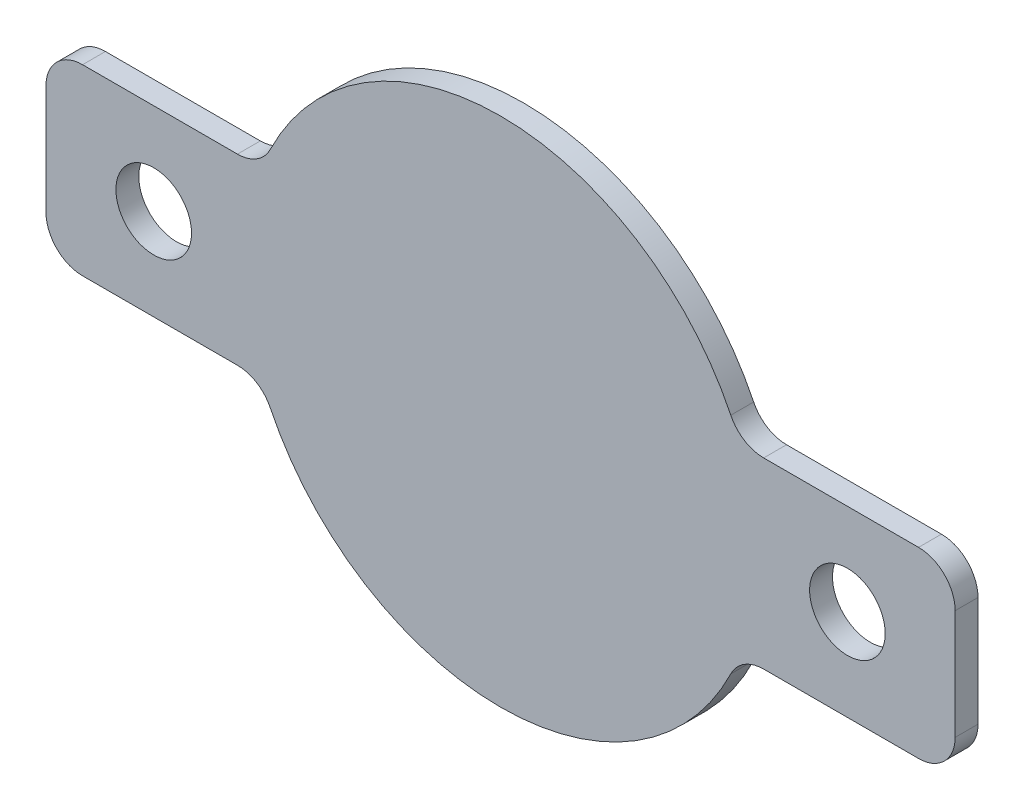
ISO-10303-21;
HEADER;
FILE_DESCRIPTION(('STEP AP214'),'2;1');
FILE_NAME('part.step','',(''),(''),'','','');
FILE_SCHEMA(('AUTOMOTIVE_DESIGN { 1 0 10303 214 1 1 1 1 }'));
ENDSEC;
DATA;
#1=APPLICATION_CONTEXT('core data for automotive mechanical design processes');
#2=APPLICATION_PROTOCOL_DEFINITION('international standard','automotive_design',2000,#1);
#3=PRODUCT_CONTEXT('',#1,'mechanical');
#4=PRODUCT('Part','Part','',(#3));
#5=PRODUCT_RELATED_PRODUCT_CATEGORY('part','',(#4));
#6=PRODUCT_DEFINITION_FORMATION('','',#4);
#7=PRODUCT_DEFINITION_CONTEXT('part definition',#1,'design');
#8=PRODUCT_DEFINITION('design','',#6,#7);
#9=PRODUCT_DEFINITION_SHAPE('','',#8);
#10=(LENGTH_UNIT() NAMED_UNIT(*) SI_UNIT(.MILLI.,.METRE.));
#11=(NAMED_UNIT(*) PLANE_ANGLE_UNIT() SI_UNIT($,.RADIAN.));
#12=(NAMED_UNIT(*) SI_UNIT($,.STERADIAN.) SOLID_ANGLE_UNIT());
#13=UNCERTAINTY_MEASURE_WITH_UNIT(LENGTH_MEASURE(1.E-05),#10,'distance_accuracy_value','');
#14=(GEOMETRIC_REPRESENTATION_CONTEXT(3) GLOBAL_UNCERTAINTY_ASSIGNED_CONTEXT((#13)) GLOBAL_UNIT_ASSIGNED_CONTEXT((#10,
#11,#12)) REPRESENTATION_CONTEXT('',''));
#15=CARTESIAN_POINT('',(0.,0.,0.));
#16=DIRECTION('',(0.,0.,1.));
#17=DIRECTION('',(1.,0.,0.));
#18=AXIS2_PLACEMENT_3D('',#15,#16,#17);
#19=CARTESIAN_POINT('',(-0.514545782896191,2.18955939318799,1.5875));
#20=DIRECTION('',(0.,0.,1.));
#21=DIRECTION('',(1.,0.,0.));
#22=AXIS2_PLACEMENT_3D('',#19,#20,#21);
#23=PLANE('',#22);
#24=CARTESIAN_POINT('',(23.5734032231875,2.18955939318799,1.5875));
#25=DIRECTION('',(0.,0.,1.));
#26=DIRECTION('',(1.,0.,0.));
#27=AXIS2_PLACEMENT_3D('',#24,#25,#26);
#28=CIRCLE('',#27,2.625);
#29=CARTESIAN_POINT('',(26.1984032231875,2.18955939318799,1.5875));
#30=VERTEX_POINT('',#29);
#31=EDGE_CURVE('E293',#30,#30,#28,.T.);
#32=ORIENTED_EDGE('',*,*,#31,.F.);
#33=EDGE_LOOP('',(#32));
#34=FACE_BOUND('',#33,.T.);
#35=DIRECTION('',(0.,-1.,0.));
#36=VECTOR('',#35,1.);
#37=CARTESIAN_POINT('',(-32.0830388201736,-4.16044060681201,1.5875));
#38=LINE('',#37,#36);
#39=CARTESIAN_POINT('',(-32.0830388201736,5.99955939318799,1.5875));
#40=VERTEX_POINT('',#39);
#41=CARTESIAN_POINT('',(-32.0830388201736,-1.62044060681201,1.5875));
#42=VERTEX_POINT('',#41);
#43=EDGE_CURVE('E322',#40,#42,#38,.T.);
#44=ORIENTED_EDGE('',*,*,#43,.T.);
#45=CARTESIAN_POINT('',(-29.5430388201736,-1.62044060681201,1.5875));
#46=DIRECTION('',(0.,0.,1.));
#47=DIRECTION('',(1.,0.,0.));
#48=AXIS2_PLACEMENT_3D('',#45,#46,#47);
#49=CIRCLE('',#48,2.54);
#50=CARTESIAN_POINT('',(-29.5430388201736,-4.16044060681201,1.5875));
#51=VERTEX_POINT('',#50);
#52=EDGE_CURVE('E220',#42,#51,#49,.T.);
#53=ORIENTED_EDGE('',*,*,#52,.T.);
#54=DIRECTION('',(1.,0.,0.));
#55=VECTOR('',#54,1.);
#56=CARTESIAN_POINT('',(-17.1219507577862,-4.16044060681201,1.5875));
#57=LINE('',#56,#55);
#58=CARTESIAN_POINT('',(-18.7866638867177,-4.16044060681201,1.5875));
#59=VERTEX_POINT('',#58);
#60=EDGE_CURVE('E175',#51,#59,#57,.T.);
#61=ORIENTED_EDGE('',*,*,#60,.T.);
#62=CARTESIAN_POINT('',(-18.7866638867177,-6.70044060681201,1.5875));
#63=DIRECTION('',(0.,0.,1.));
#64=DIRECTION('',(1.,0.,0.));
#65=AXIS2_PLACEMENT_3D('',#62,#63,#64);
#66=CIRCLE('',#65,2.54);
#67=CARTESIAN_POINT('',(-16.50264912374,-5.58919060681201,1.5875));
#68=VERTEX_POINT('',#67);
#69=EDGE_CURVE('E277',#59,#68,#66,.F.);
#70=ORIENTED_EDGE('',*,*,#69,.T.);
#71=CARTESIAN_POINT('',(-0.514545782896191,2.18955939318799,1.5875));
#72=DIRECTION('',(0.,0.,1.));
#73=DIRECTION('',(1.,0.,0.));
#74=AXIS2_PLACEMENT_3D('',#71,#72,#73);
#75=CIRCLE('',#74,17.78);
#76=CARTESIAN_POINT('',(15.4735575579476,-5.58919060681201,1.5875));
#77=VERTEX_POINT('',#76);
#78=EDGE_CURVE('E185',#68,#77,#75,.T.);
#79=ORIENTED_EDGE('',*,*,#78,.T.);
#80=CARTESIAN_POINT('',(17.7575723209253,-6.70044060681201,1.5875));
#81=DIRECTION('',(0.,0.,1.));
#82=DIRECTION('',(1.,0.,0.));
#83=AXIS2_PLACEMENT_3D('',#80,#81,#82);
#84=CIRCLE('',#83,2.54);
#85=CARTESIAN_POINT('',(17.7575723209253,-4.16044060681201,1.5875));
#86=VERTEX_POINT('',#85);
#87=EDGE_CURVE('E11',#77,#86,#84,.F.);
#88=ORIENTED_EDGE('',*,*,#87,.T.);
#89=DIRECTION('',(1.,0.,0.));
#90=VECTOR('',#89,1.);
#91=CARTESIAN_POINT('',(16.0928591919938,-4.16044060681201,1.5875));
#92=LINE('',#91,#90);
#93=CARTESIAN_POINT('',(28.5139472543812,-4.16044060681201,1.5875));
#94=VERTEX_POINT('',#93);
#95=EDGE_CURVE('E191',#86,#94,#92,.T.);
#96=ORIENTED_EDGE('',*,*,#95,.T.);
#97=CARTESIAN_POINT('',(28.5139472543812,-1.62044060681201,1.5875));
#98=DIRECTION('',(0.,0.,1.));
#99=DIRECTION('',(1.,0.,0.));
#100=AXIS2_PLACEMENT_3D('',#97,#98,#99);
#101=CIRCLE('',#100,2.54);
#102=CARTESIAN_POINT('',(31.0539472543812,-1.62044060681201,1.5875));
#103=VERTEX_POINT('',#102);
#104=EDGE_CURVE('E211',#94,#103,#101,.T.);
#105=ORIENTED_EDGE('',*,*,#104,.T.);
#106=DIRECTION('',(0.,1.,0.));
#107=VECTOR('',#106,1.);
#108=CARTESIAN_POINT('',(31.0539472543812,-4.16044060681201,1.5875));
#109=LINE('',#108,#107);
#110=CARTESIAN_POINT('',(31.0539472543812,5.99955939318799,1.5875));
#111=VERTEX_POINT('',#110);
#112=EDGE_CURVE('E305',#103,#111,#109,.T.);
#113=ORIENTED_EDGE('',*,*,#112,.T.);
#114=CARTESIAN_POINT('',(28.5139472543812,5.99955939318799,1.5875));
#115=DIRECTION('',(0.,0.,1.));
#116=DIRECTION('',(1.,0.,0.));
#117=AXIS2_PLACEMENT_3D('',#114,#115,#116);
#118=CIRCLE('',#117,2.54);
#119=CARTESIAN_POINT('',(28.5139472543812,8.53955939318799,1.5875));
#120=VERTEX_POINT('',#119);
#121=EDGE_CURVE('E214',#111,#120,#118,.T.);
#122=ORIENTED_EDGE('',*,*,#121,.T.);
#123=DIRECTION('',(-1.,0.,0.));
#124=VECTOR('',#123,1.);
#125=CARTESIAN_POINT('',(31.0539472543812,8.53955939318799,1.5875));
#126=LINE('',#125,#124);
#127=CARTESIAN_POINT('',(17.7575723209253,8.53955939318799,1.5875));
#128=VERTEX_POINT('',#127);
#129=EDGE_CURVE('E309',#120,#128,#126,.T.);
#130=ORIENTED_EDGE('',*,*,#129,.T.);
#131=CARTESIAN_POINT('',(17.7575723209253,11.079559393188,1.5875));
#132=DIRECTION('',(0.,0.,1.));
#133=DIRECTION('',(1.,0.,0.));
#134=AXIS2_PLACEMENT_3D('',#131,#132,#133);
#135=CIRCLE('',#134,2.54);
#136=CARTESIAN_POINT('',(15.4735575579476,9.96830939318799,1.5875));
#137=VERTEX_POINT('',#136);
#138=EDGE_CURVE('E267',#128,#137,#135,.F.);
#139=ORIENTED_EDGE('',*,*,#138,.T.);
#140=CARTESIAN_POINT('',(-0.514545782896191,2.18955939318799,1.5875));
#141=DIRECTION('',(0.,0.,1.));
#142=DIRECTION('',(1.,0.,0.));
#143=AXIS2_PLACEMENT_3D('',#140,#141,#142);
#144=CIRCLE('',#143,17.78);
#145=CARTESIAN_POINT('',(-16.50264912374,9.96830939318799,1.5875));
#146=VERTEX_POINT('',#145);
#147=EDGE_CURVE('E316',#137,#146,#144,.T.);
#148=ORIENTED_EDGE('',*,*,#147,.T.);
#149=CARTESIAN_POINT('',(-18.7866638867177,11.079559393188,1.5875));
#150=DIRECTION('',(0.,0.,1.));
#151=DIRECTION('',(1.,0.,0.));
#152=AXIS2_PLACEMENT_3D('',#149,#150,#151);
#153=CIRCLE('',#152,2.54);
#154=CARTESIAN_POINT('',(-18.7866638867177,8.53955939318799,1.5875));
#155=VERTEX_POINT('',#154);
#156=EDGE_CURVE('E62',#146,#155,#153,.F.);
#157=ORIENTED_EDGE('',*,*,#156,.T.);
#158=DIRECTION('',(-1.,0.,0.));
#159=VECTOR('',#158,1.);
#160=CARTESIAN_POINT('',(-32.0830388201736,8.53955939318799,1.5875));
#161=LINE('',#160,#159);
#162=CARTESIAN_POINT('',(-29.5430388201736,8.53955939318799,1.5875));
#163=VERTEX_POINT('',#162);
#164=EDGE_CURVE('E319',#155,#163,#161,.T.);
#165=ORIENTED_EDGE('',*,*,#164,.T.);
#166=CARTESIAN_POINT('',(-29.5430388201736,5.99955939318799,1.5875));
#167=DIRECTION('',(0.,0.,1.));
#168=DIRECTION('',(1.,0.,0.));
#169=AXIS2_PLACEMENT_3D('',#166,#167,#168);
#170=CIRCLE('',#169,2.54);
#171=EDGE_CURVE('E217',#163,#40,#170,.T.);
#172=ORIENTED_EDGE('',*,*,#171,.T.);
#173=EDGE_LOOP('',(#44,#53,#61,#70,#79,#88,#96,#105,#113,#122,#130,#139,#148,#157,#165,#172));
#174=FACE_BOUND('',#173,.T.);
#175=CARTESIAN_POINT('',(-24.6024947889799,2.18955939318799,1.5875));
#176=DIRECTION('',(0.,0.,1.));
#177=DIRECTION('',(1.,0.,0.));
#178=AXIS2_PLACEMENT_3D('',#175,#176,#177);
#179=CIRCLE('',#178,2.625);
#180=CARTESIAN_POINT('',(-21.9774947889799,2.18955939318799,1.5875));
#181=VERTEX_POINT('',#180);
#182=EDGE_CURVE('E383',#181,#181,#179,.T.);
#183=ORIENTED_EDGE('',*,*,#182,.F.);
#184=EDGE_LOOP('',(#183));
#185=FACE_BOUND('',#184,.T.);
#186=ADVANCED_FACE('F39',(#34,#174,#185),#23,.T.);
#187=CARTESIAN_POINT('',(-0.514545782896191,2.18955939318799,0.));
#188=DIRECTION('',(0.,0.,1.));
#189=DIRECTION('',(1.,0.,0.));
#190=AXIS2_PLACEMENT_3D('',#187,#188,#189);
#191=PLANE('',#190);
#192=DIRECTION('',(1.,0.,0.));
#193=VECTOR('',#192,1.);
#194=CARTESIAN_POINT('',(-17.1219507577862,-4.16044060681201,0.));
#195=LINE('',#194,#193);
#196=CARTESIAN_POINT('',(-29.5430388201736,-4.16044060681201,0.));
#197=VERTEX_POINT('',#196);
#198=CARTESIAN_POINT('',(-18.7866638867177,-4.16044060681201,0.));
#199=VERTEX_POINT('',#198);
#200=EDGE_CURVE('E172',#197,#199,#195,.T.);
#201=ORIENTED_EDGE('',*,*,#200,.F.);
#202=CARTESIAN_POINT('',(-29.5430388201736,-1.62044060681201,0.));
#203=DIRECTION('',(0.,0.,1.));
#204=DIRECTION('',(1.,0.,0.));
#205=AXIS2_PLACEMENT_3D('',#202,#203,#204);
#206=CIRCLE('',#205,2.54);
#207=CARTESIAN_POINT('',(-32.0830388201736,-1.62044060681201,0.));
#208=VERTEX_POINT('',#207);
#209=EDGE_CURVE('E154',#197,#208,#206,.F.);
#210=ORIENTED_EDGE('',*,*,#209,.T.);
#211=DIRECTION('',(0.,-1.,0.));
#212=VECTOR('',#211,1.);
#213=CARTESIAN_POINT('',(-32.0830388201736,-4.16044060681201,0.));
#214=LINE('',#213,#212);
#215=CARTESIAN_POINT('',(-32.0830388201736,5.99955939318799,0.));
#216=VERTEX_POINT('',#215);
#217=EDGE_CURVE('E186',#216,#208,#214,.T.);
#218=ORIENTED_EDGE('',*,*,#217,.F.);
#219=CARTESIAN_POINT('',(-29.5430388201736,5.99955939318799,0.));
#220=DIRECTION('',(0.,0.,1.));
#221=DIRECTION('',(1.,0.,0.));
#222=AXIS2_PLACEMENT_3D('',#219,#220,#221);
#223=CIRCLE('',#222,2.54);
#224=CARTESIAN_POINT('',(-29.5430388201736,8.53955939318799,0.));
#225=VERTEX_POINT('',#224);
#226=EDGE_CURVE('E166',#216,#225,#223,.F.);
#227=ORIENTED_EDGE('',*,*,#226,.T.);
#228=DIRECTION('',(-1.,0.,0.));
#229=VECTOR('',#228,1.);
#230=CARTESIAN_POINT('',(-32.0830388201736,8.53955939318799,0.));
#231=LINE('',#230,#229);
#232=CARTESIAN_POINT('',(-18.7866638867177,8.53955939318799,0.));
#233=VERTEX_POINT('',#232);
#234=EDGE_CURVE('E193',#233,#225,#231,.T.);
#235=ORIENTED_EDGE('',*,*,#234,.F.);
#236=CARTESIAN_POINT('',(-18.7866638867177,11.079559393188,0.));
#237=DIRECTION('',(0.,0.,1.));
#238=DIRECTION('',(1.,0.,0.));
#239=AXIS2_PLACEMENT_3D('',#236,#237,#238);
#240=CIRCLE('',#239,2.54);
#241=CARTESIAN_POINT('',(-16.50264912374,9.96830939318799,0.));
#242=VERTEX_POINT('',#241);
#243=EDGE_CURVE('E270',#233,#242,#240,.T.);
#244=ORIENTED_EDGE('',*,*,#243,.T.);
#245=CARTESIAN_POINT('',(-0.514545782896191,2.18955939318799,0.));
#246=DIRECTION('',(0.,0.,1.));
#247=DIRECTION('',(1.,0.,0.));
#248=AXIS2_PLACEMENT_3D('',#245,#246,#247);
#249=CIRCLE('',#248,17.78);
#250=CARTESIAN_POINT('',(15.4735575579476,9.96830939318799,0.));
#251=VERTEX_POINT('',#250);
#252=EDGE_CURVE('E337',#251,#242,#249,.T.);
#253=ORIENTED_EDGE('',*,*,#252,.F.);
#254=CARTESIAN_POINT('',(17.7575723209253,11.079559393188,0.));
#255=DIRECTION('',(0.,0.,1.));
#256=DIRECTION('',(1.,0.,0.));
#257=AXIS2_PLACEMENT_3D('',#254,#255,#256);
#258=CIRCLE('',#257,2.54);
#259=CARTESIAN_POINT('',(17.7575723209253,8.53955939318799,0.));
#260=VERTEX_POINT('',#259);
#261=EDGE_CURVE('E264',#251,#260,#258,.T.);
#262=ORIENTED_EDGE('',*,*,#261,.T.);
#263=DIRECTION('',(-1.,0.,0.));
#264=VECTOR('',#263,1.);
#265=CARTESIAN_POINT('',(31.0539472543812,8.53955939318799,0.));
#266=LINE('',#265,#264);
#267=CARTESIAN_POINT('',(28.5139472543812,8.53955939318799,0.));
#268=VERTEX_POINT('',#267);
#269=EDGE_CURVE('E333',#268,#260,#266,.T.);
#270=ORIENTED_EDGE('',*,*,#269,.F.);
#271=CARTESIAN_POINT('',(28.5139472543812,5.99955939318799,0.));
#272=DIRECTION('',(0.,0.,1.));
#273=DIRECTION('',(1.,0.,0.));
#274=AXIS2_PLACEMENT_3D('',#271,#272,#273);
#275=CIRCLE('',#274,2.54);
#276=CARTESIAN_POINT('',(31.0539472543812,5.99955939318799,0.));
#277=VERTEX_POINT('',#276);
#278=EDGE_CURVE('E201',#268,#277,#275,.F.);
#279=ORIENTED_EDGE('',*,*,#278,.T.);
#280=DIRECTION('',(0.,1.,0.));
#281=VECTOR('',#280,1.);
#282=CARTESIAN_POINT('',(31.0539472543812,-4.16044060681201,0.));
#283=LINE('',#282,#281);
#284=CARTESIAN_POINT('',(31.0539472543812,-1.62044060681201,0.));
#285=VERTEX_POINT('',#284);
#286=EDGE_CURVE('E329',#285,#277,#283,.T.);
#287=ORIENTED_EDGE('',*,*,#286,.F.);
#288=CARTESIAN_POINT('',(28.5139472543812,-1.62044060681201,0.));
#289=DIRECTION('',(0.,0.,1.));
#290=DIRECTION('',(1.,0.,0.));
#291=AXIS2_PLACEMENT_3D('',#288,#289,#290);
#292=CIRCLE('',#291,2.54);
#293=CARTESIAN_POINT('',(28.5139472543812,-4.16044060681201,0.));
#294=VERTEX_POINT('',#293);
#295=EDGE_CURVE('E177',#285,#294,#292,.F.);
#296=ORIENTED_EDGE('',*,*,#295,.T.);
#297=DIRECTION('',(1.,0.,0.));
#298=VECTOR('',#297,1.);
#299=CARTESIAN_POINT('',(16.0928591919938,-4.16044060681201,0.));
#300=LINE('',#299,#298);
#301=CARTESIAN_POINT('',(17.7575723209253,-4.16044060681201,0.));
#302=VERTEX_POINT('',#301);
#303=EDGE_CURVE('E284',#302,#294,#300,.T.);
#304=ORIENTED_EDGE('',*,*,#303,.F.);
#305=CARTESIAN_POINT('',(17.7575723209253,-6.70044060681201,0.));
#306=DIRECTION('',(0.,0.,1.));
#307=DIRECTION('',(1.,0.,0.));
#308=AXIS2_PLACEMENT_3D('',#305,#306,#307);
#309=CIRCLE('',#308,2.54);
#310=CARTESIAN_POINT('',(15.4735575579476,-5.58919060681201,0.));
#311=VERTEX_POINT('',#310);
#312=EDGE_CURVE('E48',#302,#311,#309,.T.);
#313=ORIENTED_EDGE('',*,*,#312,.T.);
#314=CARTESIAN_POINT('',(-0.514545782896191,2.18955939318799,0.));
#315=DIRECTION('',(0.,0.,1.));
#316=DIRECTION('',(1.,0.,0.));
#317=AXIS2_PLACEMENT_3D('',#314,#315,#316);
#318=CIRCLE('',#317,17.78);
#319=CARTESIAN_POINT('',(-16.50264912374,-5.58919060681201,0.));
#320=VERTEX_POINT('',#319);
#321=EDGE_CURVE('E282',#320,#311,#318,.T.);
#322=ORIENTED_EDGE('',*,*,#321,.F.);
#323=CARTESIAN_POINT('',(-18.7866638867177,-6.70044060681201,0.));
#324=DIRECTION('',(0.,0.,1.));
#325=DIRECTION('',(1.,0.,0.));
#326=AXIS2_PLACEMENT_3D('',#323,#324,#325);
#327=CIRCLE('',#326,2.54);
#328=EDGE_CURVE('E183',#320,#199,#327,.T.);
#329=ORIENTED_EDGE('',*,*,#328,.T.);
#330=EDGE_LOOP('',(#201,#210,#218,#227,#235,#244,#253,#262,#270,#279,#287,#296,#304,#313,#322,#329));
#331=FACE_BOUND('',#330,.T.);
#332=CARTESIAN_POINT('',(23.5734032231875,2.18955939318799,0.));
#333=DIRECTION('',(0.,0.,1.));
#334=DIRECTION('',(1.,0.,0.));
#335=AXIS2_PLACEMENT_3D('',#332,#333,#334);
#336=CIRCLE('',#335,2.625);
#337=CARTESIAN_POINT('',(26.1984032231875,2.18955939318799,0.));
#338=VERTEX_POINT('',#337);
#339=EDGE_CURVE('E391',#338,#338,#336,.T.);
#340=ORIENTED_EDGE('',*,*,#339,.T.);
#341=EDGE_LOOP('',(#340));
#342=FACE_BOUND('',#341,.T.);
#343=CARTESIAN_POINT('',(-24.6024947889799,2.18955939318799,0.));
#344=DIRECTION('',(0.,0.,1.));
#345=DIRECTION('',(1.,0.,0.));
#346=AXIS2_PLACEMENT_3D('',#343,#344,#345);
#347=CIRCLE('',#346,2.625);
#348=CARTESIAN_POINT('',(-21.9774947889799,2.18955939318799,0.));
#349=VERTEX_POINT('',#348);
#350=EDGE_CURVE('E386',#349,#349,#347,.T.);
#351=ORIENTED_EDGE('',*,*,#350,.T.);
#352=EDGE_LOOP('',(#351));
#353=FACE_BOUND('',#352,.T.);
#354=ADVANCED_FACE('F180',(#331,#342,#353),#191,.F.);
#355=CARTESIAN_POINT('',(-0.514545782896191,2.18955939318799,1.5875));
#356=DIRECTION('',(0.,0.,-1.));
#357=DIRECTION('',(-1.,0.,0.));
#358=AXIS2_PLACEMENT_3D('',#355,#356,#357);
#359=CYLINDRICAL_SURFACE('',#358,17.78);
#360=ORIENTED_EDGE('',*,*,#78,.F.);
#361=DIRECTION('',(0.,0.,-1.));
#362=VECTOR('',#361,1.);
#363=CARTESIAN_POINT('',(-16.50264912374,-5.58919060681201,1.5875));
#364=LINE('',#363,#362);
#365=EDGE_CURVE('E260',#68,#320,#364,.T.);
#366=ORIENTED_EDGE('',*,*,#365,.T.);
#367=ORIENTED_EDGE('',*,*,#321,.T.);
#368=DIRECTION('',(0.,0.,-1.));
#369=VECTOR('',#368,1.);
#370=CARTESIAN_POINT('',(15.4735575579476,-5.58919060681201,1.5875));
#371=LINE('',#370,#369);
#372=EDGE_CURVE('E257',#311,#77,#371,.F.);
#373=ORIENTED_EDGE('',*,*,#372,.T.);
#374=EDGE_LOOP('',(#360,#366,#367,#373));
#375=FACE_BOUND('',#374,.T.);
#376=ADVANCED_FACE('F290',(#375),#359,.T.);
#377=CARTESIAN_POINT('',(16.0928591919938,-4.16044060681201,1.5875));
#378=DIRECTION('',(0.,1.,0.));
#379=DIRECTION('',(0.,0.,1.));
#380=AXIS2_PLACEMENT_3D('',#377,#378,#379);
#381=PLANE('',#380);
#382=ORIENTED_EDGE('',*,*,#303,.T.);
#383=DIRECTION('',(0.,0.,-1.));
#384=VECTOR('',#383,1.);
#385=CARTESIAN_POINT('',(28.5139472543812,-4.16044060681201,1.5875));
#386=LINE('',#385,#384);
#387=EDGE_CURVE('E247',#294,#94,#386,.F.);
#388=ORIENTED_EDGE('',*,*,#387,.T.);
#389=ORIENTED_EDGE('',*,*,#95,.F.);
#390=DIRECTION('',(0.,0.,1.));
#391=VECTOR('',#390,1.);
#392=CARTESIAN_POINT('',(17.7575723209253,-4.16044060681201,0.));
#393=LINE('',#392,#391);
#394=EDGE_CURVE('E243',#86,#302,#393,.F.);
#395=ORIENTED_EDGE('',*,*,#394,.T.);
#396=EDGE_LOOP('',(#382,#388,#389,#395));
#397=FACE_BOUND('',#396,.T.);
#398=ADVANCED_FACE('F302',(#397),#381,.F.);
#399=CARTESIAN_POINT('',(31.0539472543812,-4.16044060681201,1.5875));
#400=DIRECTION('',(-1.,0.,0.));
#401=DIRECTION('',(0.,0.,1.));
#402=AXIS2_PLACEMENT_3D('',#399,#400,#401);
#403=PLANE('',#402);
#404=ORIENTED_EDGE('',*,*,#286,.T.);
#405=DIRECTION('',(0.,0.,-1.));
#406=VECTOR('',#405,1.);
#407=CARTESIAN_POINT('',(31.0539472543812,5.99955939318799,1.5875));
#408=LINE('',#407,#406);
#409=EDGE_CURVE('E240',#277,#111,#408,.F.);
#410=ORIENTED_EDGE('',*,*,#409,.T.);
#411=ORIENTED_EDGE('',*,*,#112,.F.);
#412=DIRECTION('',(0.,0.,-1.));
#413=VECTOR('',#412,1.);
#414=CARTESIAN_POINT('',(31.0539472543812,-1.62044060681201,1.5875));
#415=LINE('',#414,#413);
#416=EDGE_CURVE('E236',#103,#285,#415,.T.);
#417=ORIENTED_EDGE('',*,*,#416,.T.);
#418=EDGE_LOOP('',(#404,#410,#411,#417));
#419=FACE_BOUND('',#418,.T.);
#420=ADVANCED_FACE('F506',(#419),#403,.F.);
#421=CARTESIAN_POINT('',(31.0539472543812,8.53955939318799,1.5875));
#422=DIRECTION('',(0.,-1.,0.));
#423=DIRECTION('',(0.,0.,-1.));
#424=AXIS2_PLACEMENT_3D('',#421,#422,#423);
#425=PLANE('',#424);
#426=ORIENTED_EDGE('',*,*,#129,.F.);
#427=DIRECTION('',(0.,0.,-1.));
#428=VECTOR('',#427,1.);
#429=CARTESIAN_POINT('',(28.5139472543812,8.53955939318799,1.5875));
#430=LINE('',#429,#428);
#431=EDGE_CURVE('E232',#120,#268,#430,.T.);
#432=ORIENTED_EDGE('',*,*,#431,.T.);
#433=ORIENTED_EDGE('',*,*,#269,.T.);
#434=DIRECTION('',(0.,0.,1.));
#435=VECTOR('',#434,1.);
#436=CARTESIAN_POINT('',(17.7575723209253,8.53955939318799,1.5875));
#437=LINE('',#436,#435);
#438=EDGE_CURVE('E229',#260,#128,#437,.T.);
#439=ORIENTED_EDGE('',*,*,#438,.T.);
#440=EDGE_LOOP('',(#426,#432,#433,#439));
#441=FACE_BOUND('',#440,.T.);
#442=ADVANCED_FACE('F496',(#441),#425,.F.);
#443=CARTESIAN_POINT('',(-0.514545782896191,2.18955939318799,1.5875));
#444=DIRECTION('',(0.,0.,-1.));
#445=DIRECTION('',(-1.,0.,0.));
#446=AXIS2_PLACEMENT_3D('',#443,#444,#445);
#447=CYLINDRICAL_SURFACE('',#446,17.78);
#448=ORIENTED_EDGE('',*,*,#147,.F.);
#449=DIRECTION('',(0.,0.,-1.));
#450=VECTOR('',#449,1.);
#451=CARTESIAN_POINT('',(15.4735575579476,9.96830939318799,1.5875));
#452=LINE('',#451,#450);
#453=EDGE_CURVE('E253',#137,#251,#452,.T.);
#454=ORIENTED_EDGE('',*,*,#453,.T.);
#455=ORIENTED_EDGE('',*,*,#252,.T.);
#456=DIRECTION('',(0.,0.,-1.));
#457=VECTOR('',#456,1.);
#458=CARTESIAN_POINT('',(-16.50264912374,9.96830939318799,1.5875));
#459=LINE('',#458,#457);
#460=EDGE_CURVE('E250',#242,#146,#459,.F.);
#461=ORIENTED_EDGE('',*,*,#460,.T.);
#462=EDGE_LOOP('',(#448,#454,#455,#461));
#463=FACE_BOUND('',#462,.T.);
#464=ADVANCED_FACE('F359',(#463),#447,.T.);
#465=CARTESIAN_POINT('',(-32.0830388201736,8.53955939318799,1.5875));
#466=DIRECTION('',(0.,-1.,0.));
#467=DIRECTION('',(0.,0.,-1.));
#468=AXIS2_PLACEMENT_3D('',#465,#466,#467);
#469=PLANE('',#468);
#470=ORIENTED_EDGE('',*,*,#234,.T.);
#471=DIRECTION('',(0.,0.,-1.));
#472=VECTOR('',#471,1.);
#473=CARTESIAN_POINT('',(-29.5430388201736,8.53955939318799,1.5875));
#474=LINE('',#473,#472);
#475=EDGE_CURVE('E55',#225,#163,#474,.F.);
#476=ORIENTED_EDGE('',*,*,#475,.T.);
#477=ORIENTED_EDGE('',*,*,#164,.F.);
#478=DIRECTION('',(0.,0.,1.));
#479=VECTOR('',#478,1.);
#480=CARTESIAN_POINT('',(-18.7866638867177,8.53955939318799,0.));
#481=LINE('',#480,#479);
#482=EDGE_CURVE('E223',#155,#233,#481,.F.);
#483=ORIENTED_EDGE('',*,*,#482,.T.);
#484=EDGE_LOOP('',(#470,#476,#477,#483));
#485=FACE_BOUND('',#484,.T.);
#486=ADVANCED_FACE('F342',(#485),#469,.F.);
#487=CARTESIAN_POINT('',(-32.0830388201736,-4.16044060681201,1.5875));
#488=DIRECTION('',(1.,0.,0.));
#489=DIRECTION('',(0.,0.,-1.));
#490=AXIS2_PLACEMENT_3D('',#487,#488,#489);
#491=PLANE('',#490);
#492=ORIENTED_EDGE('',*,*,#217,.T.);
#493=DIRECTION('',(0.,0.,-1.));
#494=VECTOR('',#493,1.);
#495=CARTESIAN_POINT('',(-32.0830388201736,-1.62044060681201,1.5875));
#496=LINE('',#495,#494);
#497=EDGE_CURVE('E159',#208,#42,#496,.F.);
#498=ORIENTED_EDGE('',*,*,#497,.T.);
#499=ORIENTED_EDGE('',*,*,#43,.F.);
#500=DIRECTION('',(0.,0.,-1.));
#501=VECTOR('',#500,1.);
#502=CARTESIAN_POINT('',(-32.0830388201736,5.99955939318799,1.5875));
#503=LINE('',#502,#501);
#504=EDGE_CURVE('E165',#40,#216,#503,.T.);
#505=ORIENTED_EDGE('',*,*,#504,.T.);
#506=EDGE_LOOP('',(#492,#498,#499,#505));
#507=FACE_BOUND('',#506,.T.);
#508=ADVANCED_FACE('F350',(#507),#491,.F.);
#509=CARTESIAN_POINT('',(-17.1219507577862,-4.16044060681201,1.5875));
#510=DIRECTION('',(0.,1.,0.));
#511=DIRECTION('',(0.,0.,1.));
#512=AXIS2_PLACEMENT_3D('',#509,#510,#511);
#513=PLANE('',#512);
#514=ORIENTED_EDGE('',*,*,#60,.F.);
#515=DIRECTION('',(0.,0.,-1.));
#516=VECTOR('',#515,1.);
#517=CARTESIAN_POINT('',(-29.5430388201736,-4.16044060681201,1.5875));
#518=LINE('',#517,#516);
#519=EDGE_CURVE('E158',#51,#197,#518,.T.);
#520=ORIENTED_EDGE('',*,*,#519,.T.);
#521=ORIENTED_EDGE('',*,*,#200,.T.);
#522=DIRECTION('',(0.,0.,1.));
#523=VECTOR('',#522,1.);
#524=CARTESIAN_POINT('',(-18.7866638867177,-4.16044060681201,1.5875));
#525=LINE('',#524,#523);
#526=EDGE_CURVE('E178',#199,#59,#525,.T.);
#527=ORIENTED_EDGE('',*,*,#526,.T.);
#528=EDGE_LOOP('',(#514,#520,#521,#527));
#529=FACE_BOUND('',#528,.T.);
#530=ADVANCED_FACE('F171',(#529),#513,.F.);
#531=CARTESIAN_POINT('',(23.5734032231875,2.18955939318799,1.5875));
#532=DIRECTION('',(0.,0.,-1.));
#533=DIRECTION('',(-1.,0.,0.));
#534=AXIS2_PLACEMENT_3D('',#531,#532,#533);
#535=CYLINDRICAL_SURFACE('',#534,2.625);
#536=ORIENTED_EDGE('',*,*,#31,.T.);
#537=EDGE_LOOP('',(#536));
#538=FACE_BOUND('',#537,.T.);
#539=ORIENTED_EDGE('',*,*,#339,.F.);
#540=EDGE_LOOP('',(#539));
#541=FACE_BOUND('',#540,.T.);
#542=ADVANCED_FACE('F357',(#538,#541),#535,.F.);
#543=CARTESIAN_POINT('',(-24.6024947889799,2.18955939318799,1.5875));
#544=DIRECTION('',(0.,0.,-1.));
#545=DIRECTION('',(-1.,0.,0.));
#546=AXIS2_PLACEMENT_3D('',#543,#544,#545);
#547=CYLINDRICAL_SURFACE('',#546,2.625);
#548=ORIENTED_EDGE('',*,*,#182,.T.);
#549=EDGE_LOOP('',(#548));
#550=FACE_BOUND('',#549,.T.);
#551=ORIENTED_EDGE('',*,*,#350,.F.);
#552=EDGE_LOOP('',(#551));
#553=FACE_BOUND('',#552,.T.);
#554=ADVANCED_FACE('F372',(#550,#553),#547,.F.);
#555=CARTESIAN_POINT('',(-29.5430388201736,-1.62044060681201,1.5875));
#556=DIRECTION('',(0.,0.,-1.));
#557=DIRECTION('',(-1.,0.,0.));
#558=AXIS2_PLACEMENT_3D('',#555,#556,#557);
#559=CYLINDRICAL_SURFACE('',#558,2.54);
#560=ORIENTED_EDGE('',*,*,#52,.F.);
#561=ORIENTED_EDGE('',*,*,#497,.F.);
#562=ORIENTED_EDGE('',*,*,#209,.F.);
#563=ORIENTED_EDGE('',*,*,#519,.F.);
#564=EDGE_LOOP('',(#560,#561,#562,#563));
#565=FACE_BOUND('',#564,.T.);
#566=ADVANCED_FACE('F157',(#565),#559,.T.);
#567=CARTESIAN_POINT('',(-29.5430388201736,5.99955939318799,1.5875));
#568=DIRECTION('',(0.,0.,-1.));
#569=DIRECTION('',(-1.,0.,0.));
#570=AXIS2_PLACEMENT_3D('',#567,#568,#569);
#571=CYLINDRICAL_SURFACE('',#570,2.54);
#572=ORIENTED_EDGE('',*,*,#171,.F.);
#573=ORIENTED_EDGE('',*,*,#475,.F.);
#574=ORIENTED_EDGE('',*,*,#226,.F.);
#575=ORIENTED_EDGE('',*,*,#504,.F.);
#576=EDGE_LOOP('',(#572,#573,#574,#575));
#577=FACE_BOUND('',#576,.T.);
#578=ADVANCED_FACE('F346',(#577),#571,.T.);
#579=CARTESIAN_POINT('',(28.5139472543812,5.99955939318799,1.5875));
#580=DIRECTION('',(0.,0.,-1.));
#581=DIRECTION('',(-1.,0.,0.));
#582=AXIS2_PLACEMENT_3D('',#579,#580,#581);
#583=CYLINDRICAL_SURFACE('',#582,2.54);
#584=ORIENTED_EDGE('',*,*,#121,.F.);
#585=ORIENTED_EDGE('',*,*,#409,.F.);
#586=ORIENTED_EDGE('',*,*,#278,.F.);
#587=ORIENTED_EDGE('',*,*,#431,.F.);
#588=EDGE_LOOP('',(#584,#585,#586,#587));
#589=FACE_BOUND('',#588,.T.);
#590=ADVANCED_FACE('F403',(#589),#583,.T.);
#591=CARTESIAN_POINT('',(28.5139472543812,-1.62044060681201,1.5875));
#592=DIRECTION('',(0.,0.,-1.));
#593=DIRECTION('',(-1.,0.,0.));
#594=AXIS2_PLACEMENT_3D('',#591,#592,#593);
#595=CYLINDRICAL_SURFACE('',#594,2.54);
#596=ORIENTED_EDGE('',*,*,#104,.F.);
#597=ORIENTED_EDGE('',*,*,#387,.F.);
#598=ORIENTED_EDGE('',*,*,#295,.F.);
#599=ORIENTED_EDGE('',*,*,#416,.F.);
#600=EDGE_LOOP('',(#596,#597,#598,#599));
#601=FACE_BOUND('',#600,.T.);
#602=ADVANCED_FACE('F410',(#601),#595,.T.);
#603=CARTESIAN_POINT('',(17.7575723209253,11.079559393188,1.5875));
#604=DIRECTION('',(0.,0.,-1.));
#605=DIRECTION('',(-1.,0.,0.));
#606=AXIS2_PLACEMENT_3D('',#603,#604,#605);
#607=CYLINDRICAL_SURFACE('',#606,2.54);
#608=ORIENTED_EDGE('',*,*,#138,.F.);
#609=ORIENTED_EDGE('',*,*,#438,.F.);
#610=ORIENTED_EDGE('',*,*,#261,.F.);
#611=ORIENTED_EDGE('',*,*,#453,.F.);
#612=EDGE_LOOP('',(#608,#609,#610,#611));
#613=FACE_BOUND('',#612,.T.);
#614=ADVANCED_FACE('F414',(#613),#607,.F.);
#615=CARTESIAN_POINT('',(-18.7866638867177,11.079559393188,1.5875));
#616=DIRECTION('',(0.,0.,-1.));
#617=DIRECTION('',(-1.,0.,0.));
#618=AXIS2_PLACEMENT_3D('',#615,#616,#617);
#619=CYLINDRICAL_SURFACE('',#618,2.54);
#620=ORIENTED_EDGE('',*,*,#156,.F.);
#621=ORIENTED_EDGE('',*,*,#460,.F.);
#622=ORIENTED_EDGE('',*,*,#243,.F.);
#623=ORIENTED_EDGE('',*,*,#482,.F.);
#624=EDGE_LOOP('',(#620,#621,#622,#623));
#625=FACE_BOUND('',#624,.T.);
#626=ADVANCED_FACE('F418',(#625),#619,.F.);
#627=CARTESIAN_POINT('',(-18.7866638867177,-6.70044060681201,1.5875));
#628=DIRECTION('',(0.,0.,-1.));
#629=DIRECTION('',(-1.,0.,0.));
#630=AXIS2_PLACEMENT_3D('',#627,#628,#629);
#631=CYLINDRICAL_SURFACE('',#630,2.54);
#632=ORIENTED_EDGE('',*,*,#69,.F.);
#633=ORIENTED_EDGE('',*,*,#526,.F.);
#634=ORIENTED_EDGE('',*,*,#328,.F.);
#635=ORIENTED_EDGE('',*,*,#365,.F.);
#636=EDGE_LOOP('',(#632,#633,#634,#635));
#637=FACE_BOUND('',#636,.T.);
#638=ADVANCED_FACE('F421',(#637),#631,.F.);
#639=CARTESIAN_POINT('',(17.7575723209253,-6.70044060681201,1.5875));
#640=DIRECTION('',(0.,0.,-1.));
#641=DIRECTION('',(-1.,0.,0.));
#642=AXIS2_PLACEMENT_3D('',#639,#640,#641);
#643=CYLINDRICAL_SURFACE('',#642,2.54);
#644=ORIENTED_EDGE('',*,*,#87,.F.);
#645=ORIENTED_EDGE('',*,*,#372,.F.);
#646=ORIENTED_EDGE('',*,*,#312,.F.);
#647=ORIENTED_EDGE('',*,*,#394,.F.);
#648=EDGE_LOOP('',(#644,#645,#646,#647));
#649=FACE_BOUND('',#648,.T.);
#650=ADVANCED_FACE('F41',(#649),#643,.F.);
#651=CLOSED_SHELL('',(#186,#354,#376,#398,#420,#442,#464,#486,#508,#530,#542,#554,#566,#578,
#590,#602,#614,#626,#638,#650));
#652=MANIFOLD_SOLID_BREP('B2',#651);
#653=ADVANCED_BREP_SHAPE_REPRESENTATION('',(#18,#652),#14);
#654=SHAPE_DEFINITION_REPRESENTATION(#9,#653);
ENDSEC;
END-ISO-10303-21;
